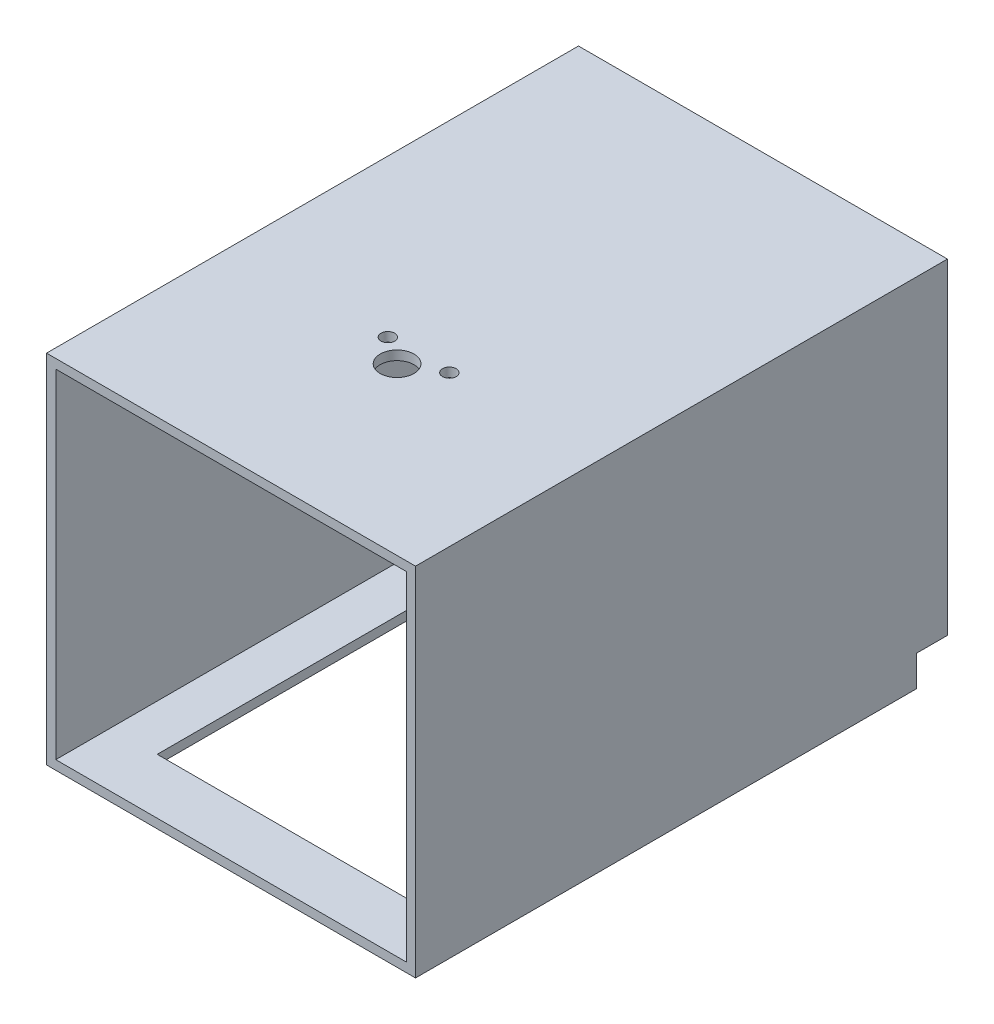
ISO-10303-21;
HEADER;
FILE_DESCRIPTION(('STEP AP214'),'2;1');
FILE_NAME('part.step','',(''),(''),'','','');
FILE_SCHEMA(('AUTOMOTIVE_DESIGN { 1 0 10303 214 1 1 1 1 }'));
ENDSEC;
DATA;
#1=APPLICATION_CONTEXT('core data for automotive mechanical design processes');
#2=APPLICATION_PROTOCOL_DEFINITION('international standard','automotive_design',2000,#1);
#3=PRODUCT_CONTEXT('',#1,'mechanical');
#4=PRODUCT('Part','Part','',(#3));
#5=PRODUCT_RELATED_PRODUCT_CATEGORY('part','',(#4));
#6=PRODUCT_DEFINITION_FORMATION('','',#4);
#7=PRODUCT_DEFINITION_CONTEXT('part definition',#1,'design');
#8=PRODUCT_DEFINITION('design','',#6,#7);
#9=PRODUCT_DEFINITION_SHAPE('','',#8);
#10=(LENGTH_UNIT() NAMED_UNIT(*) SI_UNIT(.MILLI.,.METRE.));
#11=(NAMED_UNIT(*) PLANE_ANGLE_UNIT() SI_UNIT($,.RADIAN.));
#12=(NAMED_UNIT(*) SI_UNIT($,.STERADIAN.) SOLID_ANGLE_UNIT());
#13=UNCERTAINTY_MEASURE_WITH_UNIT(LENGTH_MEASURE(1.E-05),#10,'distance_accuracy_value','');
#14=(GEOMETRIC_REPRESENTATION_CONTEXT(3) GLOBAL_UNCERTAINTY_ASSIGNED_CONTEXT((#13)) GLOBAL_UNIT_ASSIGNED_CONTEXT((#10,
#11,#12)) REPRESENTATION_CONTEXT('',''));
#15=CARTESIAN_POINT('',(0.,0.,0.));
#16=DIRECTION('',(0.,0.,1.));
#17=DIRECTION('',(1.,0.,0.));
#18=AXIS2_PLACEMENT_3D('',#15,#16,#17);
#19=CARTESIAN_POINT('',(0.,-530.,0.));
#20=DIRECTION('',(0.,0.,1.));
#21=DIRECTION('',(1.,0.,0.));
#22=AXIS2_PLACEMENT_3D('',#19,#20,#21);
#23=PLANE('',#22);
#24=DIRECTION('',(0.,-1.,0.));
#25=VECTOR('',#24,1.);
#26=CARTESIAN_POINT('',(0.,0.,0.));
#27=LINE('',#26,#25);
#28=CARTESIAN_POINT('',(0.,0.,0.));
#29=VERTEX_POINT('',#28);
#30=CARTESIAN_POINT('',(0.,-530.,0.));
#31=VERTEX_POINT('',#30);
#32=EDGE_CURVE('E290',#29,#31,#27,.T.);
#33=ORIENTED_EDGE('',*,*,#32,.F.);
#34=DIRECTION('',(-1.,0.,0.));
#35=VECTOR('',#34,1.);
#36=CARTESIAN_POINT('',(0.,0.,0.));
#37=LINE('',#36,#35);
#38=CARTESIAN_POINT('',(600.,0.,0.));
#39=VERTEX_POINT('',#38);
#40=EDGE_CURVE('E299',#39,#29,#37,.T.);
#41=ORIENTED_EDGE('',*,*,#40,.F.);
#42=DIRECTION('',(0.,1.,0.));
#43=VECTOR('',#42,1.);
#44=CARTESIAN_POINT('',(600.,0.,0.));
#45=LINE('',#44,#43);
#46=CARTESIAN_POINT('',(600.,-530.,0.));
#47=VERTEX_POINT('',#46);
#48=EDGE_CURVE('E310',#47,#39,#45,.T.);
#49=ORIENTED_EDGE('',*,*,#48,.F.);
#50=DIRECTION('',(1.,0.,0.));
#51=VECTOR('',#50,1.);
#52=CARTESIAN_POINT('',(0.,-530.,0.));
#53=LINE('',#52,#51);
#54=EDGE_CURVE('E311',#31,#47,#53,.T.);
#55=ORIENTED_EDGE('',*,*,#54,.F.);
#56=EDGE_LOOP('',(#33,#41,#49,#55));
#57=FACE_BOUND('',#56,.T.);
#58=DIRECTION('',(0.,-1.,0.));
#59=VECTOR('',#58,1.);
#60=CARTESIAN_POINT('',(15.,-15.,0.));
#61=LINE('',#60,#59);
#62=CARTESIAN_POINT('',(15.,-15.,0.));
#63=VERTEX_POINT('',#62);
#64=CARTESIAN_POINT('',(15.0000000000001,-515.,0.));
#65=VERTEX_POINT('',#64);
#66=EDGE_CURVE('E269',#63,#65,#61,.T.);
#67=ORIENTED_EDGE('',*,*,#66,.T.);
#68=DIRECTION('',(1.,0.,0.));
#69=VECTOR('',#68,1.);
#70=CARTESIAN_POINT('',(15.0000000000001,-515.,0.));
#71=LINE('',#70,#69);
#72=CARTESIAN_POINT('',(585.,-515.,0.));
#73=VERTEX_POINT('',#72);
#74=EDGE_CURVE('E272',#65,#73,#71,.T.);
#75=ORIENTED_EDGE('',*,*,#74,.T.);
#76=DIRECTION('',(0.,1.,0.));
#77=VECTOR('',#76,1.);
#78=CARTESIAN_POINT('',(585.,-15.,0.));
#79=LINE('',#78,#77);
#80=CARTESIAN_POINT('',(585.,-15.,0.));
#81=VERTEX_POINT('',#80);
#82=EDGE_CURVE('E276',#73,#81,#79,.T.);
#83=ORIENTED_EDGE('',*,*,#82,.T.);
#84=DIRECTION('',(-1.,0.,0.));
#85=VECTOR('',#84,1.);
#86=CARTESIAN_POINT('',(15.,-15.,0.));
#87=LINE('',#86,#85);
#88=EDGE_CURVE('E259',#81,#63,#87,.T.);
#89=ORIENTED_EDGE('',*,*,#88,.T.);
#90=EDGE_LOOP('',(#67,#75,#83,#89));
#91=FACE_BOUND('',#90,.T.);
#92=ADVANCED_FACE('F37',(#57,#91),#23,.F.);
#93=CARTESIAN_POINT('',(0.,0.,50.));
#94=DIRECTION('',(1.,0.,0.));
#95=DIRECTION('',(0.,1.,0.));
#96=AXIS2_PLACEMENT_3D('',#93,#94,#95);
#97=PLANE('',#96);
#98=ORIENTED_EDGE('',*,*,#32,.T.);
#99=DIRECTION('',(0.,0.,-1.));
#100=VECTOR('',#99,1.);
#101=CARTESIAN_POINT('',(0.,-530.,50.));
#102=LINE('',#101,#100);
#103=CARTESIAN_POINT('',(0.,-530.,50.));
#104=VERTEX_POINT('',#103);
#105=EDGE_CURVE('E11',#104,#31,#102,.T.);
#106=ORIENTED_EDGE('',*,*,#105,.F.);
#107=DIRECTION('',(0.,-1.,0.));
#108=VECTOR('',#107,1.);
#109=CARTESIAN_POINT('',(0.,0.,50.));
#110=LINE('',#109,#108);
#111=CARTESIAN_POINT('',(0.,-580.,50.));
#112=VERTEX_POINT('',#111);
#113=EDGE_CURVE('E245',#104,#112,#110,.T.);
#114=ORIENTED_EDGE('',*,*,#113,.T.);
#115=DIRECTION('',(0.,0.,-1.));
#116=VECTOR('',#115,1.);
#117=CARTESIAN_POINT('',(0.,-580.,65.));
#118=LINE('',#117,#116);
#119=CARTESIAN_POINT('',(0.,-580.,865.));
#120=VERTEX_POINT('',#119);
#121=EDGE_CURVE('E273',#120,#112,#118,.T.);
#122=ORIENTED_EDGE('',*,*,#121,.F.);
#123=DIRECTION('',(0.,-1.,0.));
#124=VECTOR('',#123,1.);
#125=CARTESIAN_POINT('',(0.,0.,865.));
#126=LINE('',#125,#124);
#127=CARTESIAN_POINT('',(0.,0.,865.));
#128=VERTEX_POINT('',#127);
#129=EDGE_CURVE('E239',#128,#120,#126,.T.);
#130=ORIENTED_EDGE('',*,*,#129,.F.);
#131=DIRECTION('',(0.,0.,-1.));
#132=VECTOR('',#131,1.);
#133=CARTESIAN_POINT('',(0.,0.,50.));
#134=LINE('',#133,#132);
#135=EDGE_CURVE('E298',#128,#29,#134,.T.);
#136=ORIENTED_EDGE('',*,*,#135,.T.);
#137=EDGE_LOOP('',(#98,#106,#114,#122,#130,#136));
#138=FACE_BOUND('',#137,.T.);
#139=ADVANCED_FACE('F39',(#138),#97,.F.);
#140=CARTESIAN_POINT('',(0.,-530.,50.));
#141=DIRECTION('',(0.,1.,0.));
#142=DIRECTION('',(0.,0.,1.));
#143=AXIS2_PLACEMENT_3D('',#140,#141,#142);
#144=PLANE('',#143);
#145=ORIENTED_EDGE('',*,*,#54,.T.);
#146=DIRECTION('',(0.,0.,-1.));
#147=VECTOR('',#146,1.);
#148=CARTESIAN_POINT('',(600.,-530.,50.));
#149=LINE('',#148,#147);
#150=CARTESIAN_POINT('',(600.,-530.,50.));
#151=VERTEX_POINT('',#150);
#152=EDGE_CURVE('E46',#151,#47,#149,.T.);
#153=ORIENTED_EDGE('',*,*,#152,.F.);
#154=DIRECTION('',(1.,0.,0.));
#155=VECTOR('',#154,1.);
#156=CARTESIAN_POINT('',(0.,-530.,50.));
#157=LINE('',#156,#155);
#158=EDGE_CURVE('E295',#104,#151,#157,.T.);
#159=ORIENTED_EDGE('',*,*,#158,.F.);
#160=ORIENTED_EDGE('',*,*,#105,.T.);
#161=EDGE_LOOP('',(#145,#153,#159,#160));
#162=FACE_BOUND('',#161,.T.);
#163=ADVANCED_FACE('F323',(#162),#144,.F.);
#164=CARTESIAN_POINT('',(600.,0.,50.));
#165=DIRECTION('',(-1.,0.,0.));
#166=DIRECTION('',(0.,-1.,0.));
#167=AXIS2_PLACEMENT_3D('',#164,#165,#166);
#168=PLANE('',#167);
#169=ORIENTED_EDGE('',*,*,#48,.T.);
#170=DIRECTION('',(0.,0.,-1.));
#171=VECTOR('',#170,1.);
#172=CARTESIAN_POINT('',(600.,0.,50.));
#173=LINE('',#172,#171);
#174=CARTESIAN_POINT('',(600.,0.,865.));
#175=VERTEX_POINT('',#174);
#176=EDGE_CURVE('E304',#175,#39,#173,.T.);
#177=ORIENTED_EDGE('',*,*,#176,.F.);
#178=DIRECTION('',(0.,1.,0.));
#179=VECTOR('',#178,1.);
#180=CARTESIAN_POINT('',(600.,-580.,865.));
#181=LINE('',#180,#179);
#182=CARTESIAN_POINT('',(600.,-580.,865.));
#183=VERTEX_POINT('',#182);
#184=EDGE_CURVE('E233',#183,#175,#181,.T.);
#185=ORIENTED_EDGE('',*,*,#184,.F.);
#186=DIRECTION('',(0.,0.,-1.));
#187=VECTOR('',#186,1.);
#188=CARTESIAN_POINT('',(600.,-580.,65.));
#189=LINE('',#188,#187);
#190=CARTESIAN_POINT('',(600.,-580.,50.));
#191=VERTEX_POINT('',#190);
#192=EDGE_CURVE('E333',#183,#191,#189,.T.);
#193=ORIENTED_EDGE('',*,*,#192,.T.);
#194=DIRECTION('',(0.,1.,0.));
#195=VECTOR('',#194,1.);
#196=CARTESIAN_POINT('',(600.,-580.,50.));
#197=LINE('',#196,#195);
#198=EDGE_CURVE('E253',#191,#151,#197,.T.);
#199=ORIENTED_EDGE('',*,*,#198,.T.);
#200=ORIENTED_EDGE('',*,*,#152,.T.);
#201=EDGE_LOOP('',(#169,#177,#185,#193,#199,#200));
#202=FACE_BOUND('',#201,.T.);
#203=ADVANCED_FACE('F331',(#202),#168,.F.);
#204=CARTESIAN_POINT('',(0.,0.,50.));
#205=DIRECTION('',(0.,-1.,0.));
#206=DIRECTION('',(0.,0.,-1.));
#207=AXIS2_PLACEMENT_3D('',#204,#205,#206);
#208=PLANE('',#207);
#209=CARTESIAN_POINT('',(300.,0.,595.));
#210=DIRECTION('',(0.,-1.,0.));
#211=DIRECTION('',(0.,0.,-1.));
#212=AXIS2_PLACEMENT_3D('',#209,#210,#211);
#213=CIRCLE('',#212,27.5);
#214=CARTESIAN_POINT('',(300.,0.,567.5));
#215=VERTEX_POINT('',#214);
#216=EDGE_CURVE('E430',#215,#215,#213,.T.);
#217=ORIENTED_EDGE('',*,*,#216,.T.);
#218=EDGE_LOOP('',(#217));
#219=FACE_BOUND('',#218,.T.);
#220=CARTESIAN_POINT('',(255.,0.,565.));
#221=DIRECTION('',(0.,-1.,0.));
#222=DIRECTION('',(0.,0.,-1.));
#223=AXIS2_PLACEMENT_3D('',#220,#221,#222);
#224=CIRCLE('',#223,11.180339887499);
#225=CARTESIAN_POINT('',(255.,0.,553.819660112501));
#226=VERTEX_POINT('',#225);
#227=EDGE_CURVE('E438',#226,#226,#224,.T.);
#228=ORIENTED_EDGE('',*,*,#227,.T.);
#229=EDGE_LOOP('',(#228));
#230=FACE_BOUND('',#229,.T.);
#231=CARTESIAN_POINT('',(355.,0.,565.));
#232=DIRECTION('',(0.,-1.,0.));
#233=DIRECTION('',(0.,0.,-1.));
#234=AXIS2_PLACEMENT_3D('',#231,#232,#233);
#235=CIRCLE('',#234,11.180339887499);
#236=CARTESIAN_POINT('',(355.,0.,553.819660112501));
#237=VERTEX_POINT('',#236);
#238=EDGE_CURVE('E185',#237,#237,#235,.T.);
#239=ORIENTED_EDGE('',*,*,#238,.T.);
#240=EDGE_LOOP('',(#239));
#241=FACE_BOUND('',#240,.T.);
#242=ORIENTED_EDGE('',*,*,#40,.T.);
#243=ORIENTED_EDGE('',*,*,#135,.F.);
#244=DIRECTION('',(-1.,0.,0.));
#245=VECTOR('',#244,1.);
#246=CARTESIAN_POINT('',(600.,0.,865.));
#247=LINE('',#246,#245);
#248=EDGE_CURVE('E236',#175,#128,#247,.T.);
#249=ORIENTED_EDGE('',*,*,#248,.F.);
#250=ORIENTED_EDGE('',*,*,#176,.T.);
#251=EDGE_LOOP('',(#242,#243,#249,#250));
#252=FACE_BOUND('',#251,.T.);
#253=ADVANCED_FACE('F345',(#219,#230,#241,#252),#208,.F.);
#254=CARTESIAN_POINT('',(15.,-15.,50.));
#255=DIRECTION('',(1.,0.,0.));
#256=DIRECTION('',(0.,1.,0.));
#257=AXIS2_PLACEMENT_3D('',#254,#255,#256);
#258=PLANE('',#257);
#259=ORIENTED_EDGE('',*,*,#66,.F.);
#260=DIRECTION('',(0.,0.,-1.));
#261=VECTOR('',#260,1.);
#262=CARTESIAN_POINT('',(15.,-15.,50.));
#263=LINE('',#262,#261);
#264=CARTESIAN_POINT('',(15.,-15.,50.));
#265=VERTEX_POINT('',#264);
#266=EDGE_CURVE('E268',#265,#63,#263,.T.);
#267=ORIENTED_EDGE('',*,*,#266,.F.);
#268=DIRECTION('',(0.,-1.,0.));
#269=VECTOR('',#268,1.);
#270=CARTESIAN_POINT('',(15.,-15.,50.));
#271=LINE('',#270,#269);
#272=CARTESIAN_POINT('',(15.0000000000001,-515.,50.));
#273=VERTEX_POINT('',#272);
#274=EDGE_CURVE('E255',#265,#273,#271,.T.);
#275=ORIENTED_EDGE('',*,*,#274,.T.);
#276=DIRECTION('',(0.,0.,-1.));
#277=VECTOR('',#276,1.);
#278=CARTESIAN_POINT('',(15.0000000000001,-515.,50.));
#279=LINE('',#278,#277);
#280=EDGE_CURVE('E287',#273,#65,#279,.T.);
#281=ORIENTED_EDGE('',*,*,#280,.T.);
#282=EDGE_LOOP('',(#259,#267,#275,#281));
#283=FACE_BOUND('',#282,.T.);
#284=ADVANCED_FACE('F347',(#283),#258,.T.);
#285=CARTESIAN_POINT('',(15.0000000000001,-515.,50.));
#286=DIRECTION('',(0.,1.,0.));
#287=DIRECTION('',(0.,0.,1.));
#288=AXIS2_PLACEMENT_3D('',#285,#286,#287);
#289=PLANE('',#288);
#290=ORIENTED_EDGE('',*,*,#74,.F.);
#291=ORIENTED_EDGE('',*,*,#280,.F.);
#292=DIRECTION('',(1.,0.,0.));
#293=VECTOR('',#292,1.);
#294=CARTESIAN_POINT('',(15.0000000000001,-515.,50.));
#295=LINE('',#294,#293);
#296=CARTESIAN_POINT('',(585.,-515.,50.));
#297=VERTEX_POINT('',#296);
#298=EDGE_CURVE('E258',#273,#297,#295,.T.);
#299=ORIENTED_EDGE('',*,*,#298,.T.);
#300=DIRECTION('',(0.,0.,-1.));
#301=VECTOR('',#300,1.);
#302=CARTESIAN_POINT('',(585.,-515.,50.));
#303=LINE('',#302,#301);
#304=EDGE_CURVE('E285',#297,#73,#303,.T.);
#305=ORIENTED_EDGE('',*,*,#304,.T.);
#306=EDGE_LOOP('',(#290,#291,#299,#305));
#307=FACE_BOUND('',#306,.T.);
#308=ADVANCED_FACE('F354',(#307),#289,.T.);
#309=CARTESIAN_POINT('',(585.,-15.,50.));
#310=DIRECTION('',(-1.,0.,0.));
#311=DIRECTION('',(0.,-1.,0.));
#312=AXIS2_PLACEMENT_3D('',#309,#310,#311);
#313=PLANE('',#312);
#314=ORIENTED_EDGE('',*,*,#82,.F.);
#315=ORIENTED_EDGE('',*,*,#304,.F.);
#316=DIRECTION('',(0.,1.,0.));
#317=VECTOR('',#316,1.);
#318=CARTESIAN_POINT('',(585.,-15.,50.));
#319=LINE('',#318,#317);
#320=CARTESIAN_POINT('',(585.,-15.,50.));
#321=VERTEX_POINT('',#320);
#322=EDGE_CURVE('E262',#297,#321,#319,.T.);
#323=ORIENTED_EDGE('',*,*,#322,.T.);
#324=DIRECTION('',(0.,0.,-1.));
#325=VECTOR('',#324,1.);
#326=CARTESIAN_POINT('',(585.,-15.,50.));
#327=LINE('',#326,#325);
#328=EDGE_CURVE('E283',#321,#81,#327,.T.);
#329=ORIENTED_EDGE('',*,*,#328,.T.);
#330=EDGE_LOOP('',(#314,#315,#323,#329));
#331=FACE_BOUND('',#330,.T.);
#332=ADVANCED_FACE('F368',(#331),#313,.T.);
#333=CARTESIAN_POINT('',(15.,-15.,50.));
#334=DIRECTION('',(0.,-1.,0.));
#335=DIRECTION('',(0.,0.,-1.));
#336=AXIS2_PLACEMENT_3D('',#333,#334,#335);
#337=PLANE('',#336);
#338=ORIENTED_EDGE('',*,*,#88,.F.);
#339=ORIENTED_EDGE('',*,*,#328,.F.);
#340=DIRECTION('',(-1.,0.,0.));
#341=VECTOR('',#340,1.);
#342=CARTESIAN_POINT('',(15.,-15.,50.));
#343=LINE('',#342,#341);
#344=EDGE_CURVE('E265',#321,#265,#343,.T.);
#345=ORIENTED_EDGE('',*,*,#344,.T.);
#346=ORIENTED_EDGE('',*,*,#266,.T.);
#347=EDGE_LOOP('',(#338,#339,#345,#346));
#348=FACE_BOUND('',#347,.T.);
#349=ADVANCED_FACE('F372',(#348),#337,.T.);
#350=CARTESIAN_POINT('',(0.,0.,50.));
#351=DIRECTION('',(0.,0.,1.));
#352=DIRECTION('',(1.,0.,0.));
#353=AXIS2_PLACEMENT_3D('',#350,#351,#352);
#354=PLANE('',#353);
#355=ORIENTED_EDGE('',*,*,#298,.F.);
#356=ORIENTED_EDGE('',*,*,#274,.F.);
#357=ORIENTED_EDGE('',*,*,#344,.F.);
#358=ORIENTED_EDGE('',*,*,#322,.F.);
#359=EDGE_LOOP('',(#355,#356,#357,#358));
#360=FACE_BOUND('',#359,.T.);
#361=ADVANCED_FACE('F376',(#360),#354,.F.);
#362=ORIENTED_EDGE('',*,*,#113,.F.);
#363=ORIENTED_EDGE('',*,*,#158,.T.);
#364=ORIENTED_EDGE('',*,*,#198,.F.);
#365=DIRECTION('',(1.,0.,0.));
#366=VECTOR('',#365,1.);
#367=CARTESIAN_POINT('',(0.,-580.,50.));
#368=LINE('',#367,#366);
#369=EDGE_CURVE('E248',#112,#191,#368,.T.);
#370=ORIENTED_EDGE('',*,*,#369,.F.);
#371=EDGE_LOOP('',(#362,#363,#364,#370));
#372=FACE_BOUND('',#371,.T.);
#373=ADVANCED_FACE('F327',(#372),#354,.F.);
#374=CARTESIAN_POINT('',(0.,-580.,65.));
#375=DIRECTION('',(0.,1.,0.));
#376=DIRECTION('',(0.,0.,1.));
#377=AXIS2_PLACEMENT_3D('',#374,#375,#376);
#378=PLANE('',#377);
#379=DIRECTION('',(0.,0.,1.));
#380=VECTOR('',#379,1.);
#381=CARTESIAN_POINT('',(510.,-580.,140.));
#382=LINE('',#381,#380);
#383=CARTESIAN_POINT('',(510.,-580.,140.));
#384=VERTEX_POINT('',#383);
#385=CARTESIAN_POINT('',(510.,-580.,775.));
#386=VERTEX_POINT('',#385);
#387=EDGE_CURVE('E178',#384,#386,#382,.T.);
#388=ORIENTED_EDGE('',*,*,#387,.F.);
#389=DIRECTION('',(1.,0.,0.));
#390=VECTOR('',#389,1.);
#391=CARTESIAN_POINT('',(90.,-580.,140.));
#392=LINE('',#391,#390);
#393=CARTESIAN_POINT('',(90.,-580.,140.));
#394=VERTEX_POINT('',#393);
#395=EDGE_CURVE('E195',#394,#384,#392,.T.);
#396=ORIENTED_EDGE('',*,*,#395,.F.);
#397=DIRECTION('',(0.,0.,-1.));
#398=VECTOR('',#397,1.);
#399=CARTESIAN_POINT('',(90.,-580.,775.));
#400=LINE('',#399,#398);
#401=CARTESIAN_POINT('',(90.,-580.,775.));
#402=VERTEX_POINT('',#401);
#403=EDGE_CURVE('E193',#402,#394,#400,.T.);
#404=ORIENTED_EDGE('',*,*,#403,.F.);
#405=DIRECTION('',(-1.,0.,0.));
#406=VECTOR('',#405,1.);
#407=CARTESIAN_POINT('',(510.,-580.,775.));
#408=LINE('',#407,#406);
#409=EDGE_CURVE('E53',#386,#402,#408,.T.);
#410=ORIENTED_EDGE('',*,*,#409,.F.);
#411=EDGE_LOOP('',(#388,#396,#404,#410));
#412=FACE_BOUND('',#411,.T.);
#413=ORIENTED_EDGE('',*,*,#369,.T.);
#414=ORIENTED_EDGE('',*,*,#192,.F.);
#415=DIRECTION('',(1.,0.,0.));
#416=VECTOR('',#415,1.);
#417=CARTESIAN_POINT('',(0.,-580.,865.));
#418=LINE('',#417,#416);
#419=EDGE_CURVE('E242',#120,#183,#418,.T.);
#420=ORIENTED_EDGE('',*,*,#419,.F.);
#421=ORIENTED_EDGE('',*,*,#121,.T.);
#422=EDGE_LOOP('',(#413,#414,#420,#421));
#423=FACE_BOUND('',#422,.T.);
#424=ADVANCED_FACE('F337',(#412,#423),#378,.F.);
#425=CARTESIAN_POINT('',(600.,0.,865.));
#426=DIRECTION('',(0.,0.,1.));
#427=DIRECTION('',(1.,0.,0.));
#428=AXIS2_PLACEMENT_3D('',#425,#426,#427);
#429=PLANE('',#428);
#430=ORIENTED_EDGE('',*,*,#184,.T.);
#431=ORIENTED_EDGE('',*,*,#248,.T.);
#432=ORIENTED_EDGE('',*,*,#129,.T.);
#433=ORIENTED_EDGE('',*,*,#419,.T.);
#434=EDGE_LOOP('',(#430,#431,#432,#433));
#435=FACE_BOUND('',#434,.T.);
#436=DIRECTION('',(0.,-1.,0.));
#437=VECTOR('',#436,1.);
#438=CARTESIAN_POINT('',(15.,-15.0000000000001,865.));
#439=LINE('',#438,#437);
#440=CARTESIAN_POINT('',(15.,-15.0000000000001,865.));
#441=VERTEX_POINT('',#440);
#442=CARTESIAN_POINT('',(15.0000000000001,-565.,865.));
#443=VERTEX_POINT('',#442);
#444=EDGE_CURVE('E207',#441,#443,#439,.T.);
#445=ORIENTED_EDGE('',*,*,#444,.F.);
#446=DIRECTION('',(-1.,0.,0.));
#447=VECTOR('',#446,1.);
#448=CARTESIAN_POINT('',(585.,-15.,865.));
#449=LINE('',#448,#447);
#450=CARTESIAN_POINT('',(585.,-15.,865.));
#451=VERTEX_POINT('',#450);
#452=EDGE_CURVE('E205',#451,#441,#449,.T.);
#453=ORIENTED_EDGE('',*,*,#452,.F.);
#454=DIRECTION('',(0.,1.,0.));
#455=VECTOR('',#454,1.);
#456=CARTESIAN_POINT('',(585.,-565.,865.));
#457=LINE('',#456,#455);
#458=CARTESIAN_POINT('',(585.,-565.,865.));
#459=VERTEX_POINT('',#458);
#460=EDGE_CURVE('E213',#459,#451,#457,.T.);
#461=ORIENTED_EDGE('',*,*,#460,.F.);
#462=DIRECTION('',(1.,0.,0.));
#463=VECTOR('',#462,1.);
#464=CARTESIAN_POINT('',(15.0000000000001,-565.,865.));
#465=LINE('',#464,#463);
#466=EDGE_CURVE('E210',#443,#459,#465,.T.);
#467=ORIENTED_EDGE('',*,*,#466,.F.);
#468=EDGE_LOOP('',(#445,#453,#461,#467));
#469=FACE_BOUND('',#468,.T.);
#470=ADVANCED_FACE('F341',(#435,#469),#429,.T.);
#471=CARTESIAN_POINT('',(585.,-15.,865.));
#472=DIRECTION('',(0.,-1.,0.));
#473=DIRECTION('',(1.,0.,0.));
#474=AXIS2_PLACEMENT_3D('',#471,#472,#473);
#475=PLANE('',#474);
#476=CARTESIAN_POINT('',(300.,-15.0000000000001,595.));
#477=DIRECTION('',(0.,-1.,0.));
#478=DIRECTION('',(0.,0.,-1.));
#479=AXIS2_PLACEMENT_3D('',#476,#477,#478);
#480=CIRCLE('',#479,27.5);
#481=CARTESIAN_POINT('',(300.,-15.0000000000001,567.5));
#482=VERTEX_POINT('',#481);
#483=EDGE_CURVE('E433',#482,#482,#480,.T.);
#484=ORIENTED_EDGE('',*,*,#483,.F.);
#485=EDGE_LOOP('',(#484));
#486=FACE_BOUND('',#485,.T.);
#487=CARTESIAN_POINT('',(255.,-15.0000000000001,565.));
#488=DIRECTION('',(0.,-1.,0.));
#489=DIRECTION('',(0.,0.,-1.));
#490=AXIS2_PLACEMENT_3D('',#487,#488,#489);
#491=CIRCLE('',#490,11.180339887499);
#492=CARTESIAN_POINT('',(255.,-15.0000000000001,553.819660112501));
#493=VERTEX_POINT('',#492);
#494=EDGE_CURVE('E435',#493,#493,#491,.T.);
#495=ORIENTED_EDGE('',*,*,#494,.F.);
#496=EDGE_LOOP('',(#495));
#497=FACE_BOUND('',#496,.T.);
#498=CARTESIAN_POINT('',(355.,-15.0000000000001,565.));
#499=DIRECTION('',(0.,-1.,0.));
#500=DIRECTION('',(0.,0.,-1.));
#501=AXIS2_PLACEMENT_3D('',#498,#499,#500);
#502=CIRCLE('',#501,11.180339887499);
#503=CARTESIAN_POINT('',(355.,-15.0000000000001,553.819660112501));
#504=VERTEX_POINT('',#503);
#505=EDGE_CURVE('E188',#504,#504,#502,.T.);
#506=ORIENTED_EDGE('',*,*,#505,.F.);
#507=EDGE_LOOP('',(#506));
#508=FACE_BOUND('',#507,.T.);
#509=DIRECTION('',(-1.,0.,0.));
#510=VECTOR('',#509,1.);
#511=CARTESIAN_POINT('',(585.,-15.,65.));
#512=LINE('',#511,#510);
#513=CARTESIAN_POINT('',(585.,-15.,65.));
#514=VERTEX_POINT('',#513);
#515=CARTESIAN_POINT('',(15.,-15.0000000000001,65.));
#516=VERTEX_POINT('',#515);
#517=EDGE_CURVE('E204',#514,#516,#512,.T.);
#518=ORIENTED_EDGE('',*,*,#517,.F.);
#519=DIRECTION('',(0.,0.,-1.));
#520=VECTOR('',#519,1.);
#521=CARTESIAN_POINT('',(585.,-15.,865.));
#522=LINE('',#521,#520);
#523=EDGE_CURVE('E215',#451,#514,#522,.T.);
#524=ORIENTED_EDGE('',*,*,#523,.F.);
#525=ORIENTED_EDGE('',*,*,#452,.T.);
#526=DIRECTION('',(0.,0.,-1.));
#527=VECTOR('',#526,1.);
#528=CARTESIAN_POINT('',(15.,-15.0000000000001,865.));
#529=LINE('',#528,#527);
#530=EDGE_CURVE('E230',#441,#516,#529,.T.);
#531=ORIENTED_EDGE('',*,*,#530,.T.);
#532=EDGE_LOOP('',(#518,#524,#525,#531));
#533=FACE_BOUND('',#532,.T.);
#534=ADVANCED_FACE('F392',(#486,#497,#508,#533),#475,.T.);
#535=CARTESIAN_POINT('',(15.,-15.0000000000001,865.));
#536=DIRECTION('',(1.,0.,0.));
#537=DIRECTION('',(0.,1.,0.));
#538=AXIS2_PLACEMENT_3D('',#535,#536,#537);
#539=PLANE('',#538);
#540=DIRECTION('',(0.,-1.,0.));
#541=VECTOR('',#540,1.);
#542=CARTESIAN_POINT('',(15.,-15.0000000000001,65.));
#543=LINE('',#542,#541);
#544=CARTESIAN_POINT('',(15.0000000000001,-565.,65.));
#545=VERTEX_POINT('',#544);
#546=EDGE_CURVE('E217',#516,#545,#543,.T.);
#547=ORIENTED_EDGE('',*,*,#546,.F.);
#548=ORIENTED_EDGE('',*,*,#530,.F.);
#549=ORIENTED_EDGE('',*,*,#444,.T.);
#550=DIRECTION('',(0.,0.,-1.));
#551=VECTOR('',#550,1.);
#552=CARTESIAN_POINT('',(15.0000000000001,-565.,865.));
#553=LINE('',#552,#551);
#554=EDGE_CURVE('E227',#443,#545,#553,.T.);
#555=ORIENTED_EDGE('',*,*,#554,.T.);
#556=EDGE_LOOP('',(#547,#548,#549,#555));
#557=FACE_BOUND('',#556,.T.);
#558=ADVANCED_FACE('F395',(#557),#539,.T.);
#559=CARTESIAN_POINT('',(15.0000000000001,-565.,865.));
#560=DIRECTION('',(0.,1.,0.));
#561=DIRECTION('',(0.,0.,1.));
#562=AXIS2_PLACEMENT_3D('',#559,#560,#561);
#563=PLANE('',#562);
#564=DIRECTION('',(1.,0.,0.));
#565=VECTOR('',#564,1.);
#566=CARTESIAN_POINT('',(90.,-565.,140.));
#567=LINE('',#566,#565);
#568=CARTESIAN_POINT('',(90.,-565.,140.));
#569=VERTEX_POINT('',#568);
#570=CARTESIAN_POINT('',(510.,-565.,140.));
#571=VERTEX_POINT('',#570);
#572=EDGE_CURVE('E184',#569,#571,#567,.T.);
#573=ORIENTED_EDGE('',*,*,#572,.T.);
#574=DIRECTION('',(0.,0.,1.));
#575=VECTOR('',#574,1.);
#576=CARTESIAN_POINT('',(510.,-565.,140.));
#577=LINE('',#576,#575);
#578=CARTESIAN_POINT('',(510.,-565.,775.));
#579=VERTEX_POINT('',#578);
#580=EDGE_CURVE('E172',#571,#579,#577,.T.);
#581=ORIENTED_EDGE('',*,*,#580,.T.);
#582=DIRECTION('',(-1.,0.,0.));
#583=VECTOR('',#582,1.);
#584=CARTESIAN_POINT('',(510.,-565.,775.));
#585=LINE('',#584,#583);
#586=CARTESIAN_POINT('',(90.,-565.,775.));
#587=VERTEX_POINT('',#586);
#588=EDGE_CURVE('E162',#579,#587,#585,.T.);
#589=ORIENTED_EDGE('',*,*,#588,.T.);
#590=DIRECTION('',(0.,0.,-1.));
#591=VECTOR('',#590,1.);
#592=CARTESIAN_POINT('',(90.,-565.,775.));
#593=LINE('',#592,#591);
#594=EDGE_CURVE('E171',#587,#569,#593,.T.);
#595=ORIENTED_EDGE('',*,*,#594,.T.);
#596=EDGE_LOOP('',(#573,#581,#589,#595));
#597=FACE_BOUND('',#596,.T.);
#598=DIRECTION('',(1.,0.,0.));
#599=VECTOR('',#598,1.);
#600=CARTESIAN_POINT('',(15.0000000000001,-565.,65.));
#601=LINE('',#600,#599);
#602=CARTESIAN_POINT('',(585.,-565.,65.));
#603=VERTEX_POINT('',#602);
#604=EDGE_CURVE('E219',#545,#603,#601,.T.);
#605=ORIENTED_EDGE('',*,*,#604,.F.);
#606=ORIENTED_EDGE('',*,*,#554,.F.);
#607=ORIENTED_EDGE('',*,*,#466,.T.);
#608=DIRECTION('',(0.,0.,-1.));
#609=VECTOR('',#608,1.);
#610=CARTESIAN_POINT('',(585.,-565.,865.));
#611=LINE('',#610,#609);
#612=EDGE_CURVE('E224',#459,#603,#611,.T.);
#613=ORIENTED_EDGE('',*,*,#612,.T.);
#614=EDGE_LOOP('',(#605,#606,#607,#613));
#615=FACE_BOUND('',#614,.T.);
#616=ADVANCED_FACE('F182',(#597,#615),#563,.T.);
#617=CARTESIAN_POINT('',(585.,-565.,865.));
#618=DIRECTION('',(-1.,0.,0.));
#619=DIRECTION('',(0.,-1.,0.));
#620=AXIS2_PLACEMENT_3D('',#617,#618,#619);
#621=PLANE('',#620);
#622=DIRECTION('',(0.,1.,0.));
#623=VECTOR('',#622,1.);
#624=CARTESIAN_POINT('',(585.,-565.,65.));
#625=LINE('',#624,#623);
#626=EDGE_CURVE('E208',#603,#514,#625,.T.);
#627=ORIENTED_EDGE('',*,*,#626,.F.);
#628=ORIENTED_EDGE('',*,*,#612,.F.);
#629=ORIENTED_EDGE('',*,*,#460,.T.);
#630=ORIENTED_EDGE('',*,*,#523,.T.);
#631=EDGE_LOOP('',(#627,#628,#629,#630));
#632=FACE_BOUND('',#631,.T.);
#633=ADVANCED_FACE('F388',(#632),#621,.T.);
#634=CARTESIAN_POINT('',(0.,0.,65.));
#635=DIRECTION('',(0.,0.,1.));
#636=DIRECTION('',(1.,0.,0.));
#637=AXIS2_PLACEMENT_3D('',#634,#635,#636);
#638=PLANE('',#637);
#639=ORIENTED_EDGE('',*,*,#517,.T.);
#640=ORIENTED_EDGE('',*,*,#546,.T.);
#641=ORIENTED_EDGE('',*,*,#604,.T.);
#642=ORIENTED_EDGE('',*,*,#626,.T.);
#643=EDGE_LOOP('',(#639,#640,#641,#642));
#644=FACE_BOUND('',#643,.T.);
#645=ADVANCED_FACE('F384',(#644),#638,.T.);
#646=CARTESIAN_POINT('',(90.,0.00100000000002876,140.));
#647=DIRECTION('',(0.,0.,-1.));
#648=DIRECTION('',(-1.,0.,0.));
#649=AXIS2_PLACEMENT_3D('',#646,#647,#648);
#650=PLANE('',#649);
#651=DIRECTION('',(0.,-1.,0.));
#652=VECTOR('',#651,1.);
#653=CARTESIAN_POINT('',(90.,0.00100000000002876,140.));
#654=LINE('',#653,#652);
#655=EDGE_CURVE('E61',#569,#394,#654,.T.);
#656=ORIENTED_EDGE('',*,*,#655,.T.);
#657=ORIENTED_EDGE('',*,*,#395,.T.);
#658=DIRECTION('',(0.,-1.,0.));
#659=VECTOR('',#658,1.);
#660=CARTESIAN_POINT('',(510.,0.00100000000002876,140.));
#661=LINE('',#660,#659);
#662=EDGE_CURVE('E179',#571,#384,#661,.T.);
#663=ORIENTED_EDGE('',*,*,#662,.F.);
#664=ORIENTED_EDGE('',*,*,#572,.F.);
#665=EDGE_LOOP('',(#656,#657,#663,#664));
#666=FACE_BOUND('',#665,.T.);
#667=ADVANCED_FACE('F387',(#666),#650,.F.);
#668=CARTESIAN_POINT('',(510.,0.00100000000002876,140.));
#669=DIRECTION('',(1.,0.,0.));
#670=DIRECTION('',(0.,0.,-1.));
#671=AXIS2_PLACEMENT_3D('',#668,#669,#670);
#672=PLANE('',#671);
#673=ORIENTED_EDGE('',*,*,#662,.T.);
#674=ORIENTED_EDGE('',*,*,#387,.T.);
#675=DIRECTION('',(0.,-1.,0.));
#676=VECTOR('',#675,1.);
#677=CARTESIAN_POINT('',(510.,0.00100000000002876,775.));
#678=LINE('',#677,#676);
#679=EDGE_CURVE('E165',#579,#386,#678,.T.);
#680=ORIENTED_EDGE('',*,*,#679,.F.);
#681=ORIENTED_EDGE('',*,*,#580,.F.);
#682=EDGE_LOOP('',(#673,#674,#680,#681));
#683=FACE_BOUND('',#682,.T.);
#684=ADVANCED_FACE('F175',(#683),#672,.F.);
#685=CARTESIAN_POINT('',(510.,0.00100000000002876,775.));
#686=DIRECTION('',(0.,0.,1.));
#687=DIRECTION('',(1.,0.,0.));
#688=AXIS2_PLACEMENT_3D('',#685,#686,#687);
#689=PLANE('',#688);
#690=ORIENTED_EDGE('',*,*,#679,.T.);
#691=ORIENTED_EDGE('',*,*,#409,.T.);
#692=DIRECTION('',(0.,-1.,0.));
#693=VECTOR('',#692,1.);
#694=CARTESIAN_POINT('',(90.,0.00100000000002876,775.));
#695=LINE('',#694,#693);
#696=EDGE_CURVE('E167',#587,#402,#695,.T.);
#697=ORIENTED_EDGE('',*,*,#696,.F.);
#698=ORIENTED_EDGE('',*,*,#588,.F.);
#699=EDGE_LOOP('',(#690,#691,#697,#698));
#700=FACE_BOUND('',#699,.T.);
#701=ADVANCED_FACE('F164',(#700),#689,.F.);
#702=CARTESIAN_POINT('',(90.,0.00100000000002876,775.));
#703=DIRECTION('',(-1.,0.,0.));
#704=DIRECTION('',(0.,0.,1.));
#705=AXIS2_PLACEMENT_3D('',#702,#703,#704);
#706=PLANE('',#705);
#707=ORIENTED_EDGE('',*,*,#696,.T.);
#708=ORIENTED_EDGE('',*,*,#403,.T.);
#709=ORIENTED_EDGE('',*,*,#655,.F.);
#710=ORIENTED_EDGE('',*,*,#594,.F.);
#711=EDGE_LOOP('',(#707,#708,#709,#710));
#712=FACE_BOUND('',#711,.T.);
#713=ADVANCED_FACE('F405',(#712),#706,.F.);
#714=CARTESIAN_POINT('',(355.,0.,565.));
#715=DIRECTION('',(0.,-1.,0.));
#716=DIRECTION('',(0.,0.,-1.));
#717=AXIS2_PLACEMENT_3D('',#714,#715,#716);
#718=CYLINDRICAL_SURFACE('',#717,11.180339887499);
#719=ORIENTED_EDGE('',*,*,#238,.F.);
#720=EDGE_LOOP('',(#719));
#721=FACE_BOUND('',#720,.T.);
#722=ORIENTED_EDGE('',*,*,#505,.T.);
#723=EDGE_LOOP('',(#722));
#724=FACE_BOUND('',#723,.T.);
#725=ADVANCED_FACE('F408',(#721,#724),#718,.F.);
#726=CARTESIAN_POINT('',(255.,0.,565.));
#727=DIRECTION('',(0.,-1.,0.));
#728=DIRECTION('',(0.,0.,-1.));
#729=AXIS2_PLACEMENT_3D('',#726,#727,#728);
#730=CYLINDRICAL_SURFACE('',#729,11.180339887499);
#731=ORIENTED_EDGE('',*,*,#227,.F.);
#732=EDGE_LOOP('',(#731));
#733=FACE_BOUND('',#732,.T.);
#734=ORIENTED_EDGE('',*,*,#494,.T.);
#735=EDGE_LOOP('',(#734));
#736=FACE_BOUND('',#735,.T.);
#737=ADVANCED_FACE('F418',(#733,#736),#730,.F.);
#738=CARTESIAN_POINT('',(300.,0.,595.));
#739=DIRECTION('',(0.,-1.,0.));
#740=DIRECTION('',(0.,0.,-1.));
#741=AXIS2_PLACEMENT_3D('',#738,#739,#740);
#742=CYLINDRICAL_SURFACE('',#741,27.5);
#743=ORIENTED_EDGE('',*,*,#216,.F.);
#744=EDGE_LOOP('',(#743));
#745=FACE_BOUND('',#744,.T.);
#746=ORIENTED_EDGE('',*,*,#483,.T.);
#747=EDGE_LOOP('',(#746));
#748=FACE_BOUND('',#747,.T.);
#749=ADVANCED_FACE('F422',(#745,#748),#742,.F.);
#750=CLOSED_SHELL('',(#92,#139,#163,#203,#253,#284,#308,#332,#349,#361,#373,#424,#470,#534,#558,
#616,#633,#645,#667,#684,#701,#713,#725,#737,#749));
#751=MANIFOLD_SOLID_BREP('B2',#750);
#752=ADVANCED_BREP_SHAPE_REPRESENTATION('',(#18,#751),#14);
#753=SHAPE_DEFINITION_REPRESENTATION(#9,#752);
ENDSEC;
END-ISO-10303-21;
